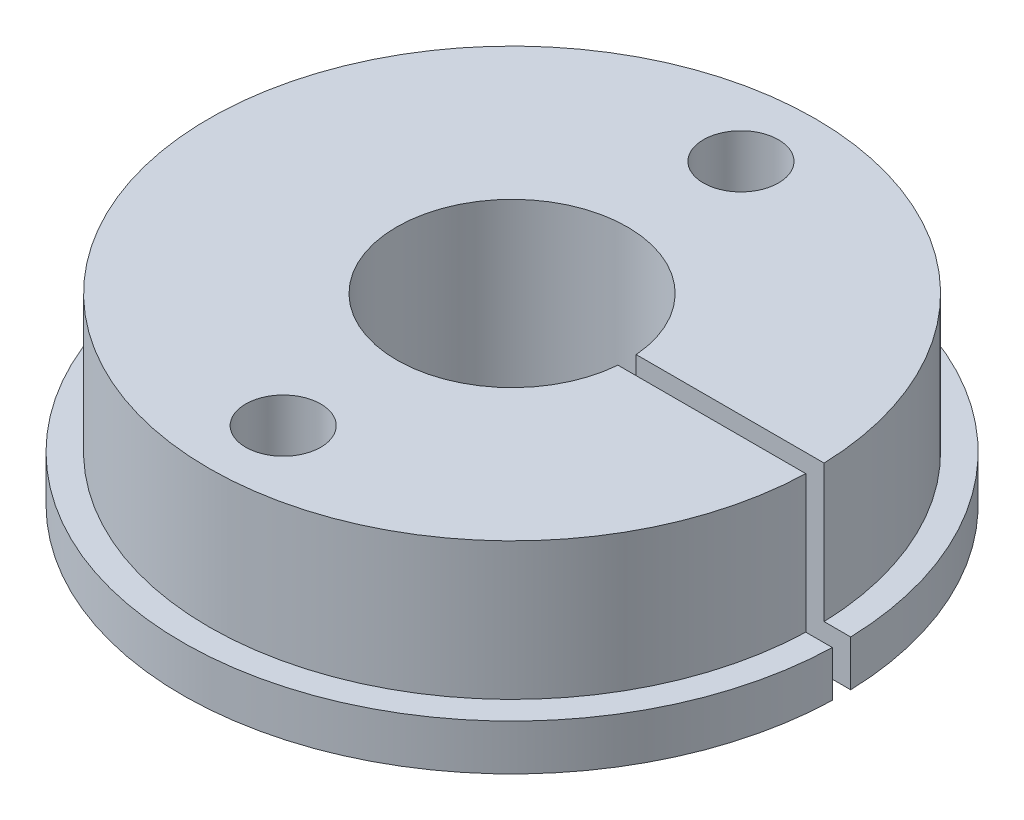
ISO-10303-21;
HEADER;
FILE_DESCRIPTION(('STEP AP214'),'2;1');
FILE_NAME('part.step','',(''),(''),'','','');
FILE_SCHEMA(('AUTOMOTIVE_DESIGN { 1 0 10303 214 1 1 1 1 }'));
ENDSEC;
DATA;
#1=APPLICATION_CONTEXT('core data for automotive mechanical design processes');
#2=APPLICATION_PROTOCOL_DEFINITION('international standard','automotive_design',2000,#1);
#3=PRODUCT_CONTEXT('',#1,'mechanical');
#4=PRODUCT('Part','Part','',(#3));
#5=PRODUCT_RELATED_PRODUCT_CATEGORY('part','',(#4));
#6=PRODUCT_DEFINITION_FORMATION('','',#4);
#7=PRODUCT_DEFINITION_CONTEXT('part definition',#1,'design');
#8=PRODUCT_DEFINITION('design','',#6,#7);
#9=PRODUCT_DEFINITION_SHAPE('','',#8);
#10=(LENGTH_UNIT() NAMED_UNIT(*) SI_UNIT(.MILLI.,.METRE.));
#11=(NAMED_UNIT(*) PLANE_ANGLE_UNIT() SI_UNIT($,.RADIAN.));
#12=(NAMED_UNIT(*) SI_UNIT($,.STERADIAN.) SOLID_ANGLE_UNIT());
#13=UNCERTAINTY_MEASURE_WITH_UNIT(LENGTH_MEASURE(1.E-05),#10,'distance_accuracy_value','');
#14=(GEOMETRIC_REPRESENTATION_CONTEXT(3) GLOBAL_UNCERTAINTY_ASSIGNED_CONTEXT((#13)) GLOBAL_UNIT_ASSIGNED_CONTEXT((#10,
#11,#12)) REPRESENTATION_CONTEXT('',''));
#15=CARTESIAN_POINT('',(0.,0.,0.));
#16=DIRECTION('',(0.,0.,1.));
#17=DIRECTION('',(1.,0.,0.));
#18=AXIS2_PLACEMENT_3D('',#15,#16,#17);
#19=CARTESIAN_POINT('',(0.,5.,0.));
#20=DIRECTION('',(0.,-1.,0.));
#21=DIRECTION('',(0.,0.,-1.));
#22=AXIS2_PLACEMENT_3D('',#19,#20,#21);
#23=CYLINDRICAL_SURFACE('',#22,36.);
#24=CARTESIAN_POINT('',(0.,5.,0.));
#25=DIRECTION('',(0.,1.,0.));
#26=DIRECTION('',(0.,0.,1.));
#27=AXIS2_PLACEMENT_3D('',#24,#25,#26);
#28=CIRCLE('',#27,36.);
#29=CARTESIAN_POINT('',(-34.8568501158667,5.,9.));
#30=VERTEX_POINT('',#29);
#31=CARTESIAN_POINT('',(35.9861084308932,5.,1.));
#32=VERTEX_POINT('',#31);
#33=EDGE_CURVE('E339',#30,#32,#28,.T.);
#34=ORIENTED_EDGE('',*,*,#33,.F.);
#35=DIRECTION('',(0.,-1.,0.));
#36=VECTOR('',#35,1.);
#37=CARTESIAN_POINT('',(-34.8568501158667,5.,9.));
#38=LINE('',#37,#36);
#39=CARTESIAN_POINT('',(-34.8568501158667,0.,9.));
#40=VERTEX_POINT('',#39);
#41=EDGE_CURVE('E210',#30,#40,#38,.T.);
#42=ORIENTED_EDGE('',*,*,#41,.T.);
#43=CARTESIAN_POINT('',(0.,0.,0.));
#44=DIRECTION('',(0.,1.,0.));
#45=DIRECTION('',(0.,0.,1.));
#46=AXIS2_PLACEMENT_3D('',#43,#44,#45);
#47=CIRCLE('',#46,36.);
#48=CARTESIAN_POINT('',(35.9861084308932,0.,1.));
#49=VERTEX_POINT('',#48);
#50=EDGE_CURVE('E352',#40,#49,#47,.T.);
#51=ORIENTED_EDGE('',*,*,#50,.T.);
#52=DIRECTION('',(0.,-1.,0.));
#53=VECTOR('',#52,1.);
#54=CARTESIAN_POINT('',(35.9861084308932,5.,1.));
#55=LINE('',#54,#53);
#56=EDGE_CURVE('E358',#32,#49,#55,.T.);
#57=ORIENTED_EDGE('',*,*,#56,.F.);
#58=EDGE_LOOP('',(#34,#42,#51,#57));
#59=FACE_BOUND('',#58,.T.);
#60=ADVANCED_FACE('F34',(#59),#23,.T.);
#61=CARTESIAN_POINT('',(0.,20.001,-25.));
#62=DIRECTION('',(0.,-1.,0.));
#63=DIRECTION('',(0.,0.,-1.));
#64=AXIS2_PLACEMENT_3D('',#61,#62,#63);
#65=CYLINDRICAL_SURFACE('',#64,4.1);
#66=CARTESIAN_POINT('',(0.,20.,-25.));
#67=DIRECTION('',(0.,1.,0.));
#68=DIRECTION('',(0.,0.,1.));
#69=AXIS2_PLACEMENT_3D('',#66,#67,#68);
#70=CIRCLE('',#69,4.1);
#71=CARTESIAN_POINT('',(0.,20.,-20.9));
#72=VERTEX_POINT('',#71);
#73=EDGE_CURVE('E313',#72,#72,#70,.F.);
#74=ORIENTED_EDGE('',*,*,#73,.F.);
#75=EDGE_LOOP('',(#74));
#76=FACE_BOUND('',#75,.T.);
#77=CARTESIAN_POINT('',(0.,6.4,-25.));
#78=DIRECTION('',(0.,-1.,0.));
#79=DIRECTION('',(0.,0.,-1.));
#80=AXIS2_PLACEMENT_3D('',#77,#78,#79);
#81=CIRCLE('',#80,4.1);
#82=CARTESIAN_POINT('',(0.,6.4,-29.1));
#83=VERTEX_POINT('',#82);
#84=EDGE_CURVE('E316',#83,#83,#81,.F.);
#85=ORIENTED_EDGE('',*,*,#84,.F.);
#86=EDGE_LOOP('',(#85));
#87=FACE_BOUND('',#86,.T.);
#88=ADVANCED_FACE('F371',(#76,#87),#65,.F.);
#89=CARTESIAN_POINT('',(0.,20.001,25.));
#90=DIRECTION('',(0.,-1.,0.));
#91=DIRECTION('',(0.,0.,-1.));
#92=AXIS2_PLACEMENT_3D('',#89,#90,#91);
#93=CYLINDRICAL_SURFACE('',#92,4.1);
#94=CARTESIAN_POINT('',(0.,20.,25.));
#95=DIRECTION('',(0.,1.,0.));
#96=DIRECTION('',(0.,0.,1.));
#97=AXIS2_PLACEMENT_3D('',#94,#95,#96);
#98=CIRCLE('',#97,4.1);
#99=CARTESIAN_POINT('',(0.,20.,29.1));
#100=VERTEX_POINT('',#99);
#101=EDGE_CURVE('E309',#100,#100,#98,.F.);
#102=ORIENTED_EDGE('',*,*,#101,.F.);
#103=EDGE_LOOP('',(#102));
#104=FACE_BOUND('',#103,.T.);
#105=CARTESIAN_POINT('',(0.,6.4,25.));
#106=DIRECTION('',(0.,-1.,0.));
#107=DIRECTION('',(0.,0.,-1.));
#108=AXIS2_PLACEMENT_3D('',#105,#106,#107);
#109=CIRCLE('',#108,4.1);
#110=CARTESIAN_POINT('',(0.,6.4,20.9));
#111=VERTEX_POINT('',#110);
#112=EDGE_CURVE('E253',#111,#111,#109,.F.);
#113=ORIENTED_EDGE('',*,*,#112,.F.);
#114=EDGE_LOOP('',(#113));
#115=FACE_BOUND('',#114,.T.);
#116=ADVANCED_FACE('F373',(#104,#115),#93,.F.);
#117=CARTESIAN_POINT('',(0.,5.,0.));
#118=DIRECTION('',(0.,-1.,0.));
#119=DIRECTION('',(0.,0.,-1.));
#120=AXIS2_PLACEMENT_3D('',#117,#118,#119);
#121=CYLINDRICAL_SURFACE('',#120,12.6);
#122=CARTESIAN_POINT('',(0.,0.,0.));
#123=DIRECTION('',(0.,1.,0.));
#124=DIRECTION('',(0.,0.,1.));
#125=AXIS2_PLACEMENT_3D('',#122,#123,#124);
#126=CIRCLE('',#125,12.6);
#127=CARTESIAN_POINT('',(12.5602547744861,0.,-1.));
#128=VERTEX_POINT('',#127);
#129=CARTESIAN_POINT('',(12.5602547744861,0.,1.));
#130=VERTEX_POINT('',#129);
#131=EDGE_CURVE('E336',#128,#130,#126,.T.);
#132=ORIENTED_EDGE('',*,*,#131,.F.);
#133=DIRECTION('',(0.,-1.,0.));
#134=VECTOR('',#133,1.);
#135=CARTESIAN_POINT('',(12.5602547744861,5.,-1.));
#136=LINE('',#135,#134);
#137=CARTESIAN_POINT('',(12.5602547744861,20.,-1.));
#138=VERTEX_POINT('',#137);
#139=EDGE_CURVE('E42',#138,#128,#136,.T.);
#140=ORIENTED_EDGE('',*,*,#139,.F.);
#141=CARTESIAN_POINT('',(0.,20.,0.));
#142=DIRECTION('',(0.,1.,0.));
#143=DIRECTION('',(0.,0.,1.));
#144=AXIS2_PLACEMENT_3D('',#141,#142,#143);
#145=CIRCLE('',#144,12.6);
#146=CARTESIAN_POINT('',(12.5602547744861,20.,1.));
#147=VERTEX_POINT('',#146);
#148=EDGE_CURVE('E325',#147,#138,#145,.F.);
#149=ORIENTED_EDGE('',*,*,#148,.F.);
#150=DIRECTION('',(0.,-1.,0.));
#151=VECTOR('',#150,1.);
#152=CARTESIAN_POINT('',(12.5602547744861,5.,1.));
#153=LINE('',#152,#151);
#154=EDGE_CURVE('E347',#147,#130,#153,.T.);
#155=ORIENTED_EDGE('',*,*,#154,.T.);
#156=EDGE_LOOP('',(#132,#140,#149,#155));
#157=FACE_BOUND('',#156,.T.);
#158=ADVANCED_FACE('F36',(#157),#121,.F.);
#159=CARTESIAN_POINT('',(0.,5.,-1.));
#160=DIRECTION('',(0.,0.,-1.));
#161=DIRECTION('',(-1.,0.,0.));
#162=AXIS2_PLACEMENT_3D('',#159,#160,#161);
#163=PLANE('',#162);
#164=DIRECTION('',(1.,0.,0.));
#165=VECTOR('',#164,1.);
#166=CARTESIAN_POINT('',(0.,0.,-1.));
#167=LINE('',#166,#165);
#168=CARTESIAN_POINT('',(35.9861084308932,0.,-1.));
#169=VERTEX_POINT('',#168);
#170=EDGE_CURVE('E350',#128,#169,#167,.T.);
#171=ORIENTED_EDGE('',*,*,#170,.T.);
#172=DIRECTION('',(0.,-1.,0.));
#173=VECTOR('',#172,1.);
#174=CARTESIAN_POINT('',(35.9861084308932,5.,-1.));
#175=LINE('',#174,#173);
#176=CARTESIAN_POINT('',(35.9861084308932,5.,-1.));
#177=VERTEX_POINT('',#176);
#178=EDGE_CURVE('E361',#177,#169,#175,.T.);
#179=ORIENTED_EDGE('',*,*,#178,.F.);
#180=DIRECTION('',(1.,0.,0.));
#181=VECTOR('',#180,1.);
#182=CARTESIAN_POINT('',(0.,5.,-1.));
#183=LINE('',#182,#181);
#184=CARTESIAN_POINT('',(33.0848908113658,5.,-1.));
#185=VERTEX_POINT('',#184);
#186=EDGE_CURVE('E337',#185,#177,#183,.T.);
#187=ORIENTED_EDGE('',*,*,#186,.F.);
#188=DIRECTION('',(0.,-1.,0.));
#189=VECTOR('',#188,1.);
#190=CARTESIAN_POINT('',(33.0848908113658,20.,-1.));
#191=LINE('',#190,#189);
#192=CARTESIAN_POINT('',(33.0848908113658,20.,-1.));
#193=VERTEX_POINT('',#192);
#194=EDGE_CURVE('E333',#193,#185,#191,.T.);
#195=ORIENTED_EDGE('',*,*,#194,.F.);
#196=DIRECTION('',(1.,0.,0.));
#197=VECTOR('',#196,1.);
#198=CARTESIAN_POINT('',(0.,20.,-1.));
#199=LINE('',#198,#197);
#200=EDGE_CURVE('E317',#138,#193,#199,.T.);
#201=ORIENTED_EDGE('',*,*,#200,.F.);
#202=ORIENTED_EDGE('',*,*,#139,.T.);
#203=EDGE_LOOP('',(#171,#179,#187,#195,#201,#202));
#204=FACE_BOUND('',#203,.T.);
#205=ADVANCED_FACE('F408',(#204),#163,.F.);
#206=CARTESIAN_POINT('',(-34.8568501158667,0.,-9.));
#207=VERTEX_POINT('',#206);
#208=EDGE_CURVE('E353',#169,#207,#47,.T.);
#209=ORIENTED_EDGE('',*,*,#208,.T.);
#210=DIRECTION('',(0.,-1.,0.));
#211=VECTOR('',#210,1.);
#212=CARTESIAN_POINT('',(-34.8568501158667,5.,-9.));
#213=LINE('',#212,#211);
#214=CARTESIAN_POINT('',(-34.8568501158667,5.,-9.));
#215=VERTEX_POINT('',#214);
#216=EDGE_CURVE('E49',#207,#215,#213,.F.);
#217=ORIENTED_EDGE('',*,*,#216,.T.);
#218=EDGE_CURVE('E341',#177,#215,#28,.T.);
#219=ORIENTED_EDGE('',*,*,#218,.F.);
#220=ORIENTED_EDGE('',*,*,#178,.T.);
#221=EDGE_LOOP('',(#209,#217,#219,#220));
#222=FACE_BOUND('',#221,.T.);
#223=ADVANCED_FACE('F384',(#222),#23,.T.);
#224=CARTESIAN_POINT('',(0.,5.,1.));
#225=DIRECTION('',(0.,0.,-1.));
#226=DIRECTION('',(-1.,0.,0.));
#227=AXIS2_PLACEMENT_3D('',#224,#225,#226);
#228=PLANE('',#227);
#229=DIRECTION('',(1.,0.,0.));
#230=VECTOR('',#229,1.);
#231=CARTESIAN_POINT('',(0.,0.,1.));
#232=LINE('',#231,#230);
#233=EDGE_CURVE('E340',#130,#49,#232,.T.);
#234=ORIENTED_EDGE('',*,*,#233,.F.);
#235=ORIENTED_EDGE('',*,*,#154,.F.);
#236=DIRECTION('',(-1.,0.,0.));
#237=VECTOR('',#236,1.);
#238=CARTESIAN_POINT('',(0.,20.,1.));
#239=LINE('',#238,#237);
#240=CARTESIAN_POINT('',(33.0848908113658,20.,1.));
#241=VERTEX_POINT('',#240);
#242=EDGE_CURVE('E322',#241,#147,#239,.T.);
#243=ORIENTED_EDGE('',*,*,#242,.F.);
#244=DIRECTION('',(0.,-1.,0.));
#245=VECTOR('',#244,1.);
#246=CARTESIAN_POINT('',(33.0848908113658,20.,1.));
#247=LINE('',#246,#245);
#248=CARTESIAN_POINT('',(33.0848908113658,5.,1.));
#249=VERTEX_POINT('',#248);
#250=EDGE_CURVE('E328',#241,#249,#247,.T.);
#251=ORIENTED_EDGE('',*,*,#250,.T.);
#252=DIRECTION('',(1.,0.,0.));
#253=VECTOR('',#252,1.);
#254=CARTESIAN_POINT('',(0.,5.,1.));
#255=LINE('',#254,#253);
#256=EDGE_CURVE('E344',#249,#32,#255,.T.);
#257=ORIENTED_EDGE('',*,*,#256,.T.);
#258=ORIENTED_EDGE('',*,*,#56,.T.);
#259=EDGE_LOOP('',(#234,#235,#243,#251,#257,#258));
#260=FACE_BOUND('',#259,.T.);
#261=ADVANCED_FACE('F400',(#260),#228,.T.);
#262=CARTESIAN_POINT('',(0.,5.,0.));
#263=DIRECTION('',(0.,1.,0.));
#264=DIRECTION('',(0.,0.,1.));
#265=AXIS2_PLACEMENT_3D('',#262,#263,#264);
#266=PLANE('',#265);
#267=DIRECTION('',(1.,0.,0.));
#268=VECTOR('',#267,1.);
#269=CARTESIAN_POINT('',(0.,5.,9.));
#270=LINE('',#269,#268);
#271=CARTESIAN_POINT('',(-33.5,5.,9.));
#272=VERTEX_POINT('',#271);
#273=EDGE_CURVE('E208',#30,#272,#270,.T.);
#274=ORIENTED_EDGE('',*,*,#273,.F.);
#275=ORIENTED_EDGE('',*,*,#33,.T.);
#276=ORIENTED_EDGE('',*,*,#256,.F.);
#277=CARTESIAN_POINT('',(0.,5.,0.));
#278=DIRECTION('',(0.,1.,0.));
#279=DIRECTION('',(0.,0.,1.));
#280=AXIS2_PLACEMENT_3D('',#277,#278,#279);
#281=CIRCLE('',#280,33.1);
#282=EDGE_CURVE('E312',#185,#249,#281,.T.);
#283=ORIENTED_EDGE('',*,*,#282,.F.);
#284=ORIENTED_EDGE('',*,*,#186,.T.);
#285=ORIENTED_EDGE('',*,*,#218,.T.);
#286=DIRECTION('',(-1.,0.,0.));
#287=VECTOR('',#286,1.);
#288=CARTESIAN_POINT('',(0.,5.,-9.));
#289=LINE('',#288,#287);
#290=CARTESIAN_POINT('',(-33.5,5.,-9.));
#291=VERTEX_POINT('',#290);
#292=EDGE_CURVE('E204',#291,#215,#289,.T.);
#293=ORIENTED_EDGE('',*,*,#292,.F.);
#294=DIRECTION('',(0.,0.,-1.));
#295=VECTOR('',#294,1.);
#296=CARTESIAN_POINT('',(-33.5,5.,0.));
#297=LINE('',#296,#295);
#298=EDGE_CURVE('E190',#272,#291,#297,.T.);
#299=ORIENTED_EDGE('',*,*,#298,.F.);
#300=EDGE_LOOP('',(#274,#275,#276,#283,#284,#285,#293,#299));
#301=FACE_BOUND('',#300,.T.);
#302=ADVANCED_FACE('F397',(#301),#266,.T.);
#303=CARTESIAN_POINT('',(0.,0.,0.));
#304=DIRECTION('',(0.,1.,0.));
#305=DIRECTION('',(0.,0.,1.));
#306=AXIS2_PLACEMENT_3D('',#303,#304,#305);
#307=PLANE('',#306);
#308=DIRECTION('',(-0.00485619934996557,0.,0.999988208594418));
#309=VECTOR('',#308,1.);
#310=CARTESIAN_POINT('',(6.61842678153596,0.,21.2215840703481));
#311=LINE('',#310,#309);
#312=CARTESIAN_POINT('',(6.61842678153596,0.,21.2215840703481));
#313=VERTEX_POINT('',#312);
#314=CARTESIAN_POINT('',(6.58141757191034,0.,28.8425177610715));
#315=VERTEX_POINT('',#314);
#316=EDGE_CURVE('E236',#313,#315,#311,.T.);
#317=ORIENTED_EDGE('',*,*,#316,.F.);
#318=DIRECTION('',(0.863587092452676,0.,0.504199696300121));
#319=VECTOR('',#318,1.);
#320=CARTESIAN_POINT('',(0.0370092096256153,0.,17.3790663092766));
#321=LINE('',#320,#319);
#322=CARTESIAN_POINT('',(0.0370092096256153,0.,17.3790663092766));
#323=VERTEX_POINT('',#322);
#324=EDGE_CURVE('E57',#323,#313,#321,.T.);
#325=ORIENTED_EDGE('',*,*,#324,.F.);
#326=DIRECTION('',(0.868443291802641,0.,-0.495788512294298));
#327=VECTOR('',#326,1.);
#328=CARTESIAN_POINT('',(-6.58141757191035,0.,21.1574822389285));
#329=LINE('',#328,#327);
#330=CARTESIAN_POINT('',(-6.58141757191035,0.,21.1574822389285));
#331=VERTEX_POINT('',#330);
#332=EDGE_CURVE('E219',#331,#323,#329,.T.);
#333=ORIENTED_EDGE('',*,*,#332,.F.);
#334=DIRECTION('',(0.00485619934996533,0.,-0.999988208594418));
#335=VECTOR('',#334,1.);
#336=CARTESIAN_POINT('',(-6.61842678153597,0.,28.7784159296519));
#337=LINE('',#336,#335);
#338=CARTESIAN_POINT('',(-6.61842678153597,0.,28.7784159296519));
#339=VERTEX_POINT('',#338);
#340=EDGE_CURVE('E246',#339,#331,#337,.T.);
#341=ORIENTED_EDGE('',*,*,#340,.F.);
#342=DIRECTION('',(-0.863587092452676,0.,-0.504199696300121));
#343=VECTOR('',#342,1.);
#344=CARTESIAN_POINT('',(-0.0370092096256262,0.,32.6209336907234));
#345=LINE('',#344,#343);
#346=CARTESIAN_POINT('',(-0.0370092096256262,0.,32.6209336907234));
#347=VERTEX_POINT('',#346);
#348=EDGE_CURVE('E243',#347,#339,#345,.T.);
#349=ORIENTED_EDGE('',*,*,#348,.F.);
#350=DIRECTION('',(-0.868443291802641,0.,0.495788512294298));
#351=VECTOR('',#350,1.);
#352=CARTESIAN_POINT('',(6.58141757191034,0.,28.8425177610715));
#353=LINE('',#352,#351);
#354=EDGE_CURVE('E240',#315,#347,#353,.T.);
#355=ORIENTED_EDGE('',*,*,#354,.F.);
#356=EDGE_LOOP('',(#317,#325,#333,#341,#349,#355));
#357=FACE_BOUND('',#356,.T.);
#358=DIRECTION('',(-0.00485619934996523,0.,0.999988208594418));
#359=VECTOR('',#358,1.);
#360=CARTESIAN_POINT('',(6.61842678153598,0.,-28.7784159296519));
#361=LINE('',#360,#359);
#362=CARTESIAN_POINT('',(6.61842678153598,0.,-28.7784159296519));
#363=VERTEX_POINT('',#362);
#364=CARTESIAN_POINT('',(6.58141757191036,0.,-21.1574822389285));
#365=VERTEX_POINT('',#364);
#366=EDGE_CURVE('E284',#363,#365,#361,.T.);
#367=ORIENTED_EDGE('',*,*,#366,.F.);
#368=DIRECTION('',(0.863587092452675,0.,0.504199696300121));
#369=VECTOR('',#368,1.);
#370=CARTESIAN_POINT('',(0.0370092096256217,0.,-32.6209336907234));
#371=LINE('',#370,#369);
#372=CARTESIAN_POINT('',(0.0370092096256217,0.,-32.6209336907234));
#373=VERTEX_POINT('',#372);
#374=EDGE_CURVE('E214',#373,#363,#371,.T.);
#375=ORIENTED_EDGE('',*,*,#374,.F.);
#376=DIRECTION('',(0.868443291802641,0.,-0.495788512294298));
#377=VECTOR('',#376,1.);
#378=CARTESIAN_POINT('',(-6.58141757191034,0.,-28.8425177610715));
#379=LINE('',#378,#377);
#380=CARTESIAN_POINT('',(-6.58141757191034,0.,-28.8425177610715));
#381=VERTEX_POINT('',#380);
#382=EDGE_CURVE('E267',#381,#373,#379,.T.);
#383=ORIENTED_EDGE('',*,*,#382,.F.);
#384=DIRECTION('',(0.00485619934996534,0.,-0.999988208594418));
#385=VECTOR('',#384,1.);
#386=CARTESIAN_POINT('',(-6.61842678153596,0.,-21.2215840703481));
#387=LINE('',#386,#385);
#388=CARTESIAN_POINT('',(-6.61842678153596,0.,-21.2215840703481));
#389=VERTEX_POINT('',#388);
#390=EDGE_CURVE('E293',#389,#381,#387,.T.);
#391=ORIENTED_EDGE('',*,*,#390,.F.);
#392=DIRECTION('',(-0.863587092452676,0.,-0.504199696300121));
#393=VECTOR('',#392,1.);
#394=CARTESIAN_POINT('',(-0.0370092096256104,0.,-17.3790663092766));
#395=LINE('',#394,#393);
#396=CARTESIAN_POINT('',(-0.0370092096256104,0.,-17.3790663092766));
#397=VERTEX_POINT('',#396);
#398=EDGE_CURVE('E290',#397,#389,#395,.T.);
#399=ORIENTED_EDGE('',*,*,#398,.F.);
#400=DIRECTION('',(-0.868443291802641,0.,0.495788512294298));
#401=VECTOR('',#400,1.);
#402=CARTESIAN_POINT('',(6.58141757191036,0.,-21.1574822389285));
#403=LINE('',#402,#401);
#404=EDGE_CURVE('E287',#365,#397,#403,.T.);
#405=ORIENTED_EDGE('',*,*,#404,.F.);
#406=EDGE_LOOP('',(#367,#375,#383,#391,#399,#405));
#407=FACE_BOUND('',#406,.T.);
#408=ORIENTED_EDGE('',*,*,#50,.F.);
#409=DIRECTION('',(1.,0.,0.));
#410=VECTOR('',#409,1.);
#411=CARTESIAN_POINT('',(0.,0.,9.));
#412=LINE('',#411,#410);
#413=CARTESIAN_POINT('',(-33.5,0.,9.));
#414=VERTEX_POINT('',#413);
#415=EDGE_CURVE('E11',#40,#414,#412,.T.);
#416=ORIENTED_EDGE('',*,*,#415,.T.);
#417=DIRECTION('',(0.,0.,-1.));
#418=VECTOR('',#417,1.);
#419=CARTESIAN_POINT('',(-33.5,0.,9.));
#420=LINE('',#419,#418);
#421=CARTESIAN_POINT('',(-33.5,0.,-9.));
#422=VERTEX_POINT('',#421);
#423=EDGE_CURVE('E188',#414,#422,#420,.T.);
#424=ORIENTED_EDGE('',*,*,#423,.T.);
#425=DIRECTION('',(-1.,0.,0.));
#426=VECTOR('',#425,1.);
#427=CARTESIAN_POINT('',(-46.5,0.,-9.));
#428=LINE('',#427,#426);
#429=EDGE_CURVE('E193',#422,#207,#428,.T.);
#430=ORIENTED_EDGE('',*,*,#429,.T.);
#431=ORIENTED_EDGE('',*,*,#208,.F.);
#432=ORIENTED_EDGE('',*,*,#170,.F.);
#433=ORIENTED_EDGE('',*,*,#131,.T.);
#434=ORIENTED_EDGE('',*,*,#233,.T.);
#435=EDGE_LOOP('',(#408,#416,#424,#430,#431,#432,#433,#434));
#436=FACE_BOUND('',#435,.T.);
#437=ADVANCED_FACE('F201',(#357,#407,#436),#307,.F.);
#438=CARTESIAN_POINT('',(0.,20.,0.));
#439=DIRECTION('',(0.,-1.,0.));
#440=DIRECTION('',(0.,0.,-1.));
#441=AXIS2_PLACEMENT_3D('',#438,#439,#440);
#442=CYLINDRICAL_SURFACE('',#441,33.1);
#443=ORIENTED_EDGE('',*,*,#282,.T.);
#444=ORIENTED_EDGE('',*,*,#250,.F.);
#445=CARTESIAN_POINT('',(0.,20.,0.));
#446=DIRECTION('',(0.,1.,0.));
#447=DIRECTION('',(0.,0.,1.));
#448=AXIS2_PLACEMENT_3D('',#445,#446,#447);
#449=CIRCLE('',#448,33.1);
#450=EDGE_CURVE('E320',#193,#241,#449,.T.);
#451=ORIENTED_EDGE('',*,*,#450,.F.);
#452=ORIENTED_EDGE('',*,*,#194,.T.);
#453=EDGE_LOOP('',(#443,#444,#451,#452));
#454=FACE_BOUND('',#453,.T.);
#455=ADVANCED_FACE('F392',(#454),#442,.T.);
#456=CARTESIAN_POINT('',(0.,20.,0.));
#457=DIRECTION('',(0.,1.,0.));
#458=DIRECTION('',(0.,0.,1.));
#459=AXIS2_PLACEMENT_3D('',#456,#457,#458);
#460=PLANE('',#459);
#461=ORIENTED_EDGE('',*,*,#101,.T.);
#462=EDGE_LOOP('',(#461));
#463=FACE_BOUND('',#462,.T.);
#464=ORIENTED_EDGE('',*,*,#73,.T.);
#465=EDGE_LOOP('',(#464));
#466=FACE_BOUND('',#465,.T.);
#467=ORIENTED_EDGE('',*,*,#200,.T.);
#468=ORIENTED_EDGE('',*,*,#450,.T.);
#469=ORIENTED_EDGE('',*,*,#242,.T.);
#470=ORIENTED_EDGE('',*,*,#148,.T.);
#471=EDGE_LOOP('',(#467,#468,#469,#470));
#472=FACE_BOUND('',#471,.T.);
#473=ADVANCED_FACE('F388',(#463,#466,#472),#460,.T.);
#474=CARTESIAN_POINT('',(0.,6.4,0.));
#475=DIRECTION('',(0.,-1.,0.));
#476=DIRECTION('',(0.,0.,-1.));
#477=AXIS2_PLACEMENT_3D('',#474,#475,#476);
#478=PLANE('',#477);
#479=DIRECTION('',(0.863587092452676,0.,0.504199696300121));
#480=VECTOR('',#479,1.);
#481=CARTESIAN_POINT('',(0.0370092096256153,6.4,17.3790663092766));
#482=LINE('',#481,#480);
#483=CARTESIAN_POINT('',(0.0370092096256153,6.4,17.3790663092766));
#484=VERTEX_POINT('',#483);
#485=CARTESIAN_POINT('',(6.61842678153596,6.4,21.2215840703481));
#486=VERTEX_POINT('',#485);
#487=EDGE_CURVE('E215',#484,#486,#482,.T.);
#488=ORIENTED_EDGE('',*,*,#487,.T.);
#489=DIRECTION('',(-0.00485619934996557,0.,0.999988208594418));
#490=VECTOR('',#489,1.);
#491=CARTESIAN_POINT('',(6.61842678153596,6.4,21.2215840703481));
#492=LINE('',#491,#490);
#493=CARTESIAN_POINT('',(6.58141757191034,6.4,28.8425177610715));
#494=VERTEX_POINT('',#493);
#495=EDGE_CURVE('E218',#486,#494,#492,.T.);
#496=ORIENTED_EDGE('',*,*,#495,.T.);
#497=DIRECTION('',(-0.868443291802641,0.,0.495788512294298));
#498=VECTOR('',#497,1.);
#499=CARTESIAN_POINT('',(6.58141757191034,6.4,28.8425177610715));
#500=LINE('',#499,#498);
#501=CARTESIAN_POINT('',(-0.0370092096256262,6.4,32.6209336907234));
#502=VERTEX_POINT('',#501);
#503=EDGE_CURVE('E222',#494,#502,#500,.T.);
#504=ORIENTED_EDGE('',*,*,#503,.T.);
#505=DIRECTION('',(-0.863587092452676,0.,-0.504199696300121));
#506=VECTOR('',#505,1.);
#507=CARTESIAN_POINT('',(-0.0370092096256262,6.4,32.6209336907234));
#508=LINE('',#507,#506);
#509=CARTESIAN_POINT('',(-6.61842678153597,6.4,28.7784159296519));
#510=VERTEX_POINT('',#509);
#511=EDGE_CURVE('E225',#502,#510,#508,.T.);
#512=ORIENTED_EDGE('',*,*,#511,.T.);
#513=DIRECTION('',(0.00485619934996533,0.,-0.999988208594418));
#514=VECTOR('',#513,1.);
#515=CARTESIAN_POINT('',(-6.61842678153597,6.4,28.7784159296519));
#516=LINE('',#515,#514);
#517=CARTESIAN_POINT('',(-6.58141757191035,6.4,21.1574822389285));
#518=VERTEX_POINT('',#517);
#519=EDGE_CURVE('E228',#510,#518,#516,.T.);
#520=ORIENTED_EDGE('',*,*,#519,.T.);
#521=DIRECTION('',(0.868443291802641,0.,-0.495788512294298));
#522=VECTOR('',#521,1.);
#523=CARTESIAN_POINT('',(-6.58141757191035,6.4,21.1574822389285));
#524=LINE('',#523,#522);
#525=EDGE_CURVE('E231',#518,#484,#524,.T.);
#526=ORIENTED_EDGE('',*,*,#525,.T.);
#527=EDGE_LOOP('',(#488,#496,#504,#512,#520,#526));
#528=FACE_BOUND('',#527,.T.);
#529=ORIENTED_EDGE('',*,*,#112,.T.);
#530=EDGE_LOOP('',(#529));
#531=FACE_BOUND('',#530,.T.);
#532=ADVANCED_FACE('F391',(#528,#531),#478,.T.);
#533=CARTESIAN_POINT('',(0.0370092096256153,6.4,17.3790663092766));
#534=DIRECTION('',(0.504199696300121,0.,-0.863587092452676));
#535=DIRECTION('',(-0.863587092452676,0.,-0.504199696300121));
#536=AXIS2_PLACEMENT_3D('',#533,#534,#535);
#537=PLANE('',#536);
#538=ORIENTED_EDGE('',*,*,#324,.T.);
#539=DIRECTION('',(0.,-1.,0.));
#540=VECTOR('',#539,1.);
#541=CARTESIAN_POINT('',(6.61842678153596,6.4,21.2215840703481));
#542=LINE('',#541,#540);
#543=EDGE_CURVE('E234',#486,#313,#542,.T.);
#544=ORIENTED_EDGE('',*,*,#543,.F.);
#545=ORIENTED_EDGE('',*,*,#487,.F.);
#546=DIRECTION('',(0.,-1.,0.));
#547=VECTOR('',#546,1.);
#548=CARTESIAN_POINT('',(0.0370092096256153,6.4,17.3790663092766));
#549=LINE('',#548,#547);
#550=EDGE_CURVE('E251',#484,#323,#549,.T.);
#551=ORIENTED_EDGE('',*,*,#550,.T.);
#552=EDGE_LOOP('',(#538,#544,#545,#551));
#553=FACE_BOUND('',#552,.T.);
#554=ADVANCED_FACE('F449',(#553),#537,.F.);
#555=CARTESIAN_POINT('',(-6.58141757191035,6.4,21.1574822389285));
#556=DIRECTION('',(-0.495788512294298,0.,-0.868443291802641));
#557=DIRECTION('',(-0.868443291802641,0.,0.495788512294298));
#558=AXIS2_PLACEMENT_3D('',#555,#556,#557);
#559=PLANE('',#558);
#560=ORIENTED_EDGE('',*,*,#332,.T.);
#561=ORIENTED_EDGE('',*,*,#550,.F.);
#562=ORIENTED_EDGE('',*,*,#525,.F.);
#563=DIRECTION('',(0.,-1.,0.));
#564=VECTOR('',#563,1.);
#565=CARTESIAN_POINT('',(-6.58141757191035,6.4,21.1574822389285));
#566=LINE('',#565,#564);
#567=EDGE_CURVE('E254',#518,#331,#566,.T.);
#568=ORIENTED_EDGE('',*,*,#567,.T.);
#569=EDGE_LOOP('',(#560,#561,#562,#568));
#570=FACE_BOUND('',#569,.T.);
#571=ADVANCED_FACE('F451',(#570),#559,.F.);
#572=CARTESIAN_POINT('',(-6.61842678153597,6.4,28.7784159296519));
#573=DIRECTION('',(-0.999988208594418,0.,-0.00485619934996533));
#574=DIRECTION('',(-0.00485619934996533,0.,0.999988208594418));
#575=AXIS2_PLACEMENT_3D('',#572,#573,#574);
#576=PLANE('',#575);
#577=ORIENTED_EDGE('',*,*,#340,.T.);
#578=ORIENTED_EDGE('',*,*,#567,.F.);
#579=ORIENTED_EDGE('',*,*,#519,.F.);
#580=DIRECTION('',(0.,-1.,0.));
#581=VECTOR('',#580,1.);
#582=CARTESIAN_POINT('',(-6.61842678153597,6.4,28.7784159296519));
#583=LINE('',#582,#581);
#584=EDGE_CURVE('E256',#510,#339,#583,.T.);
#585=ORIENTED_EDGE('',*,*,#584,.T.);
#586=EDGE_LOOP('',(#577,#578,#579,#585));
#587=FACE_BOUND('',#586,.T.);
#588=ADVANCED_FACE('F454',(#587),#576,.F.);
#589=CARTESIAN_POINT('',(-0.0370092096256262,6.4,32.6209336907234));
#590=DIRECTION('',(-0.504199696300121,0.,0.863587092452676));
#591=DIRECTION('',(0.863587092452676,0.,0.504199696300121));
#592=AXIS2_PLACEMENT_3D('',#589,#590,#591);
#593=PLANE('',#592);
#594=ORIENTED_EDGE('',*,*,#348,.T.);
#595=ORIENTED_EDGE('',*,*,#584,.F.);
#596=ORIENTED_EDGE('',*,*,#511,.F.);
#597=DIRECTION('',(0.,-1.,0.));
#598=VECTOR('',#597,1.);
#599=CARTESIAN_POINT('',(-0.0370092096256262,6.4,32.6209336907234));
#600=LINE('',#599,#598);
#601=EDGE_CURVE('E258',#502,#347,#600,.T.);
#602=ORIENTED_EDGE('',*,*,#601,.T.);
#603=EDGE_LOOP('',(#594,#595,#596,#602));
#604=FACE_BOUND('',#603,.T.);
#605=ADVANCED_FACE('F458',(#604),#593,.F.);
#606=CARTESIAN_POINT('',(6.58141757191034,6.4,28.8425177610715));
#607=DIRECTION('',(0.495788512294298,0.,0.868443291802641));
#608=DIRECTION('',(0.868443291802641,0.,-0.495788512294298));
#609=AXIS2_PLACEMENT_3D('',#606,#607,#608);
#610=PLANE('',#609);
#611=ORIENTED_EDGE('',*,*,#354,.T.);
#612=ORIENTED_EDGE('',*,*,#601,.F.);
#613=ORIENTED_EDGE('',*,*,#503,.F.);
#614=DIRECTION('',(0.,-1.,0.));
#615=VECTOR('',#614,1.);
#616=CARTESIAN_POINT('',(6.58141757191034,6.4,28.8425177610715));
#617=LINE('',#616,#615);
#618=EDGE_CURVE('E260',#494,#315,#617,.T.);
#619=ORIENTED_EDGE('',*,*,#618,.T.);
#620=EDGE_LOOP('',(#611,#612,#613,#619));
#621=FACE_BOUND('',#620,.T.);
#622=ADVANCED_FACE('F462',(#621),#610,.F.);
#623=CARTESIAN_POINT('',(6.61842678153596,6.4,21.2215840703481));
#624=DIRECTION('',(0.999988208594418,0.,0.00485619934996557));
#625=DIRECTION('',(0.00485619934996557,0.,-0.999988208594418));
#626=AXIS2_PLACEMENT_3D('',#623,#624,#625);
#627=PLANE('',#626);
#628=ORIENTED_EDGE('',*,*,#316,.T.);
#629=ORIENTED_EDGE('',*,*,#618,.F.);
#630=ORIENTED_EDGE('',*,*,#495,.F.);
#631=ORIENTED_EDGE('',*,*,#543,.T.);
#632=EDGE_LOOP('',(#628,#629,#630,#631));
#633=FACE_BOUND('',#632,.T.);
#634=ADVANCED_FACE('F466',(#633),#627,.F.);
#635=CARTESIAN_POINT('',(0.,6.4,0.));
#636=DIRECTION('',(0.,-1.,0.));
#637=DIRECTION('',(0.,0.,-1.));
#638=AXIS2_PLACEMENT_3D('',#635,#636,#637);
#639=PLANE('',#638);
#640=DIRECTION('',(0.863587092452675,0.,0.504199696300121));
#641=VECTOR('',#640,1.);
#642=CARTESIAN_POINT('',(0.0370092096256217,6.4,-32.6209336907234));
#643=LINE('',#642,#641);
#644=CARTESIAN_POINT('',(0.0370092096256217,6.4,-32.6209336907234));
#645=VERTEX_POINT('',#644);
#646=CARTESIAN_POINT('',(6.61842678153598,6.4,-28.7784159296519));
#647=VERTEX_POINT('',#646);
#648=EDGE_CURVE('E263',#645,#647,#643,.T.);
#649=ORIENTED_EDGE('',*,*,#648,.T.);
#650=DIRECTION('',(-0.00485619934996523,0.,0.999988208594418));
#651=VECTOR('',#650,1.);
#652=CARTESIAN_POINT('',(6.61842678153598,6.4,-28.7784159296519));
#653=LINE('',#652,#651);
#654=CARTESIAN_POINT('',(6.58141757191036,6.4,-21.1574822389285));
#655=VERTEX_POINT('',#654);
#656=EDGE_CURVE('E266',#647,#655,#653,.T.);
#657=ORIENTED_EDGE('',*,*,#656,.T.);
#658=DIRECTION('',(-0.868443291802641,0.,0.495788512294298));
#659=VECTOR('',#658,1.);
#660=CARTESIAN_POINT('',(6.58141757191036,6.4,-21.1574822389285));
#661=LINE('',#660,#659);
#662=CARTESIAN_POINT('',(-0.0370092096256104,6.4,-17.3790663092766));
#663=VERTEX_POINT('',#662);
#664=EDGE_CURVE('E270',#655,#663,#661,.T.);
#665=ORIENTED_EDGE('',*,*,#664,.T.);
#666=DIRECTION('',(-0.863587092452676,0.,-0.504199696300121));
#667=VECTOR('',#666,1.);
#668=CARTESIAN_POINT('',(-0.0370092096256104,6.4,-17.3790663092766));
#669=LINE('',#668,#667);
#670=CARTESIAN_POINT('',(-6.61842678153596,6.4,-21.2215840703481));
#671=VERTEX_POINT('',#670);
#672=EDGE_CURVE('E273',#663,#671,#669,.T.);
#673=ORIENTED_EDGE('',*,*,#672,.T.);
#674=DIRECTION('',(0.00485619934996534,0.,-0.999988208594418));
#675=VECTOR('',#674,1.);
#676=CARTESIAN_POINT('',(-6.61842678153596,6.4,-21.2215840703481));
#677=LINE('',#676,#675);
#678=CARTESIAN_POINT('',(-6.58141757191034,6.4,-28.8425177610715));
#679=VERTEX_POINT('',#678);
#680=EDGE_CURVE('E276',#671,#679,#677,.T.);
#681=ORIENTED_EDGE('',*,*,#680,.T.);
#682=DIRECTION('',(0.868443291802641,0.,-0.495788512294298));
#683=VECTOR('',#682,1.);
#684=CARTESIAN_POINT('',(-6.58141757191034,6.4,-28.8425177610715));
#685=LINE('',#684,#683);
#686=EDGE_CURVE('E279',#679,#645,#685,.T.);
#687=ORIENTED_EDGE('',*,*,#686,.T.);
#688=EDGE_LOOP('',(#649,#657,#665,#673,#681,#687));
#689=FACE_BOUND('',#688,.T.);
#690=ORIENTED_EDGE('',*,*,#84,.T.);
#691=EDGE_LOOP('',(#690));
#692=FACE_BOUND('',#691,.T.);
#693=ADVANCED_FACE('F369',(#689,#692),#639,.T.);
#694=CARTESIAN_POINT('',(0.0370092096256217,6.4,-32.6209336907234));
#695=DIRECTION('',(0.504199696300121,0.,-0.863587092452675));
#696=DIRECTION('',(-0.863587092452675,0.,-0.504199696300121));
#697=AXIS2_PLACEMENT_3D('',#694,#695,#696);
#698=PLANE('',#697);
#699=ORIENTED_EDGE('',*,*,#374,.T.);
#700=DIRECTION('',(0.,-1.,0.));
#701=VECTOR('',#700,1.);
#702=CARTESIAN_POINT('',(6.61842678153598,6.4,-28.7784159296519));
#703=LINE('',#702,#701);
#704=EDGE_CURVE('E282',#647,#363,#703,.T.);
#705=ORIENTED_EDGE('',*,*,#704,.F.);
#706=ORIENTED_EDGE('',*,*,#648,.F.);
#707=DIRECTION('',(0.,-1.,0.));
#708=VECTOR('',#707,1.);
#709=CARTESIAN_POINT('',(0.0370092096256217,6.4,-32.6209336907234));
#710=LINE('',#709,#708);
#711=EDGE_CURVE('E237',#645,#373,#710,.T.);
#712=ORIENTED_EDGE('',*,*,#711,.T.);
#713=EDGE_LOOP('',(#699,#705,#706,#712));
#714=FACE_BOUND('',#713,.T.);
#715=ADVANCED_FACE('F475',(#714),#698,.F.);
#716=CARTESIAN_POINT('',(-6.58141757191034,6.4,-28.8425177610715));
#717=DIRECTION('',(-0.495788512294298,0.,-0.868443291802641));
#718=DIRECTION('',(-0.868443291802641,0.,0.495788512294298));
#719=AXIS2_PLACEMENT_3D('',#716,#717,#718);
#720=PLANE('',#719);
#721=ORIENTED_EDGE('',*,*,#382,.T.);
#722=ORIENTED_EDGE('',*,*,#711,.F.);
#723=ORIENTED_EDGE('',*,*,#686,.F.);
#724=DIRECTION('',(0.,-1.,0.));
#725=VECTOR('',#724,1.);
#726=CARTESIAN_POINT('',(-6.58141757191034,6.4,-28.8425177610715));
#727=LINE('',#726,#725);
#728=EDGE_CURVE('E299',#679,#381,#727,.T.);
#729=ORIENTED_EDGE('',*,*,#728,.T.);
#730=EDGE_LOOP('',(#721,#722,#723,#729));
#731=FACE_BOUND('',#730,.T.);
#732=ADVANCED_FACE('F477',(#731),#720,.F.);
#733=CARTESIAN_POINT('',(-6.61842678153596,6.4,-21.2215840703481));
#734=DIRECTION('',(-0.999988208594418,0.,-0.00485619934996534));
#735=DIRECTION('',(-0.00485619934996534,0.,0.999988208594418));
#736=AXIS2_PLACEMENT_3D('',#733,#734,#735);
#737=PLANE('',#736);
#738=ORIENTED_EDGE('',*,*,#390,.T.);
#739=ORIENTED_EDGE('',*,*,#728,.F.);
#740=ORIENTED_EDGE('',*,*,#680,.F.);
#741=DIRECTION('',(0.,-1.,0.));
#742=VECTOR('',#741,1.);
#743=CARTESIAN_POINT('',(-6.61842678153596,6.4,-21.2215840703481));
#744=LINE('',#743,#742);
#745=EDGE_CURVE('E301',#671,#389,#744,.T.);
#746=ORIENTED_EDGE('',*,*,#745,.T.);
#747=EDGE_LOOP('',(#738,#739,#740,#746));
#748=FACE_BOUND('',#747,.T.);
#749=ADVANCED_FACE('F480',(#748),#737,.F.);
#750=CARTESIAN_POINT('',(-0.0370092096256104,6.4,-17.3790663092766));
#751=DIRECTION('',(-0.504199696300121,0.,0.863587092452676));
#752=DIRECTION('',(0.863587092452676,0.,0.504199696300121));
#753=AXIS2_PLACEMENT_3D('',#750,#751,#752);
#754=PLANE('',#753);
#755=ORIENTED_EDGE('',*,*,#398,.T.);
#756=ORIENTED_EDGE('',*,*,#745,.F.);
#757=ORIENTED_EDGE('',*,*,#672,.F.);
#758=DIRECTION('',(0.,-1.,0.));
#759=VECTOR('',#758,1.);
#760=CARTESIAN_POINT('',(-0.0370092096256104,6.4,-17.3790663092766));
#761=LINE('',#760,#759);
#762=EDGE_CURVE('E303',#663,#397,#761,.T.);
#763=ORIENTED_EDGE('',*,*,#762,.T.);
#764=EDGE_LOOP('',(#755,#756,#757,#763));
#765=FACE_BOUND('',#764,.T.);
#766=ADVANCED_FACE('F484',(#765),#754,.F.);
#767=CARTESIAN_POINT('',(6.58141757191036,6.4,-21.1574822389285));
#768=DIRECTION('',(0.495788512294298,0.,0.868443291802641));
#769=DIRECTION('',(0.868443291802641,0.,-0.495788512294298));
#770=AXIS2_PLACEMENT_3D('',#767,#768,#769);
#771=PLANE('',#770);
#772=ORIENTED_EDGE('',*,*,#404,.T.);
#773=ORIENTED_EDGE('',*,*,#762,.F.);
#774=ORIENTED_EDGE('',*,*,#664,.F.);
#775=DIRECTION('',(0.,-1.,0.));
#776=VECTOR('',#775,1.);
#777=CARTESIAN_POINT('',(6.58141757191036,6.4,-21.1574822389285));
#778=LINE('',#777,#776);
#779=EDGE_CURVE('E305',#655,#365,#778,.T.);
#780=ORIENTED_EDGE('',*,*,#779,.T.);
#781=EDGE_LOOP('',(#772,#773,#774,#780));
#782=FACE_BOUND('',#781,.T.);
#783=ADVANCED_FACE('F441',(#782),#771,.F.);
#784=CARTESIAN_POINT('',(6.61842678153598,6.4,-28.7784159296519));
#785=DIRECTION('',(0.999988208594418,0.,0.00485619934996523));
#786=DIRECTION('',(0.00485619934996523,0.,-0.999988208594418));
#787=AXIS2_PLACEMENT_3D('',#784,#785,#786);
#788=PLANE('',#787);
#789=ORIENTED_EDGE('',*,*,#366,.T.);
#790=ORIENTED_EDGE('',*,*,#779,.F.);
#791=ORIENTED_EDGE('',*,*,#656,.F.);
#792=ORIENTED_EDGE('',*,*,#704,.T.);
#793=EDGE_LOOP('',(#789,#790,#791,#792));
#794=FACE_BOUND('',#793,.T.);
#795=ADVANCED_FACE('F434',(#794),#788,.F.);
#796=CARTESIAN_POINT('',(-46.5,0.,9.));
#797=DIRECTION('',(0.,0.,1.));
#798=DIRECTION('',(1.,0.,0.));
#799=AXIS2_PLACEMENT_3D('',#796,#797,#798);
#800=PLANE('',#799);
#801=ORIENTED_EDGE('',*,*,#273,.T.);
#802=DIRECTION('',(0.,1.,0.));
#803=VECTOR('',#802,1.);
#804=CARTESIAN_POINT('',(-33.5,0.,9.));
#805=LINE('',#804,#803);
#806=EDGE_CURVE('E192',#414,#272,#805,.T.);
#807=ORIENTED_EDGE('',*,*,#806,.F.);
#808=ORIENTED_EDGE('',*,*,#415,.F.);
#809=ORIENTED_EDGE('',*,*,#41,.F.);
#810=EDGE_LOOP('',(#801,#807,#808,#809));
#811=FACE_BOUND('',#810,.T.);
#812=ADVANCED_FACE('F432',(#811),#800,.F.);
#813=CARTESIAN_POINT('',(-46.5,0.,-9.));
#814=DIRECTION('',(0.,0.,-1.));
#815=DIRECTION('',(-1.,0.,0.));
#816=AXIS2_PLACEMENT_3D('',#813,#814,#815);
#817=PLANE('',#816);
#818=ORIENTED_EDGE('',*,*,#429,.F.);
#819=DIRECTION('',(0.,1.,0.));
#820=VECTOR('',#819,1.);
#821=CARTESIAN_POINT('',(-33.5,0.,-9.));
#822=LINE('',#821,#820);
#823=EDGE_CURVE('E184',#422,#291,#822,.T.);
#824=ORIENTED_EDGE('',*,*,#823,.T.);
#825=ORIENTED_EDGE('',*,*,#292,.T.);
#826=ORIENTED_EDGE('',*,*,#216,.F.);
#827=EDGE_LOOP('',(#818,#824,#825,#826));
#828=FACE_BOUND('',#827,.T.);
#829=ADVANCED_FACE('F195',(#828),#817,.F.);
#830=CARTESIAN_POINT('',(-33.5,0.,9.));
#831=DIRECTION('',(1.,0.,0.));
#832=DIRECTION('',(0.,0.,-1.));
#833=AXIS2_PLACEMENT_3D('',#830,#831,#832);
#834=PLANE('',#833);
#835=ORIENTED_EDGE('',*,*,#298,.T.);
#836=ORIENTED_EDGE('',*,*,#823,.F.);
#837=ORIENTED_EDGE('',*,*,#423,.F.);
#838=ORIENTED_EDGE('',*,*,#806,.T.);
#839=EDGE_LOOP('',(#835,#836,#837,#838));
#840=FACE_BOUND('',#839,.T.);
#841=ADVANCED_FACE('F185',(#840),#834,.F.);
#842=CLOSED_SHELL('',(#60,#88,#116,#158,#205,#223,#261,#302,#437,#455,#473,#532,#554,#571,#588,
#605,#622,#634,#693,#715,#732,#749,#766,#783,#795,#812,#829,#841));
#843=MANIFOLD_SOLID_BREP('B2',#842);
#844=ADVANCED_BREP_SHAPE_REPRESENTATION('',(#18,#843),#14);
#845=SHAPE_DEFINITION_REPRESENTATION(#9,#844);
ENDSEC;
END-ISO-10303-21;
